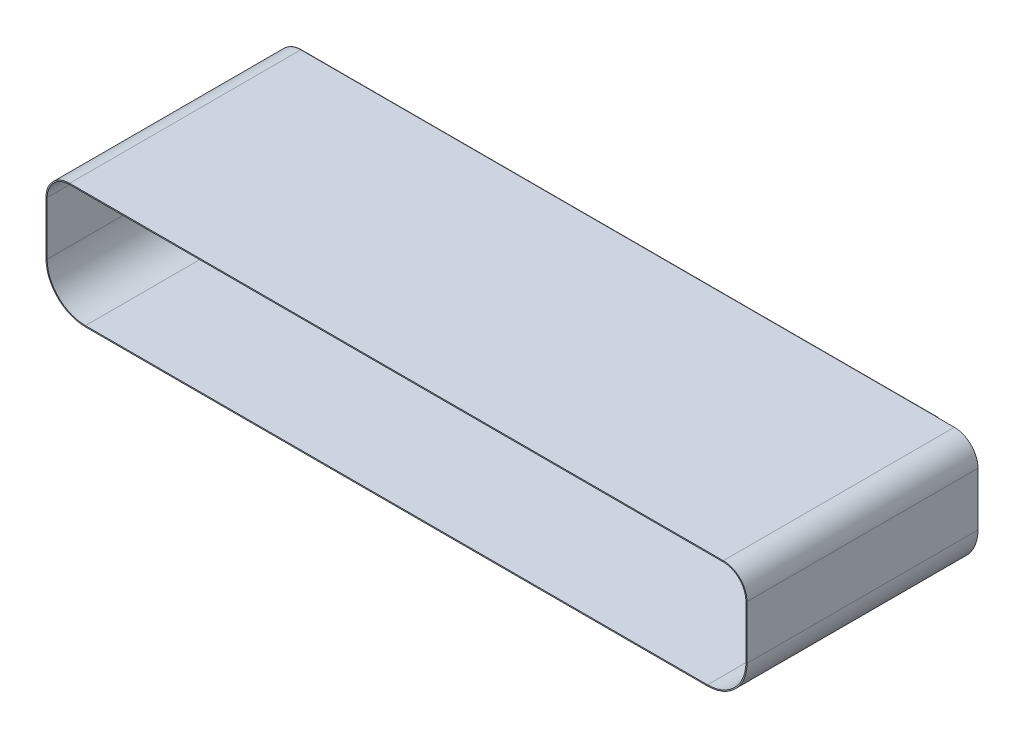
ISO-10303-21;
HEADER;
FILE_DESCRIPTION(('STEP AP214'),'2;1');
FILE_NAME('part.step','',(''),(''),'','','');
FILE_SCHEMA(('AUTOMOTIVE_DESIGN { 1 0 10303 214 1 1 1 1 }'));
ENDSEC;
DATA;
#1=APPLICATION_CONTEXT('core data for automotive mechanical design processes');
#2=APPLICATION_PROTOCOL_DEFINITION('international standard','automotive_design',2000,#1);
#3=PRODUCT_CONTEXT('',#1,'mechanical');
#4=PRODUCT('Part','Part','',(#3));
#5=PRODUCT_RELATED_PRODUCT_CATEGORY('part','',(#4));
#6=PRODUCT_DEFINITION_FORMATION('','',#4);
#7=PRODUCT_DEFINITION_CONTEXT('part definition',#1,'design');
#8=PRODUCT_DEFINITION('design','',#6,#7);
#9=PRODUCT_DEFINITION_SHAPE('','',#8);
#10=(LENGTH_UNIT() NAMED_UNIT(*) SI_UNIT(.MILLI.,.METRE.));
#11=(NAMED_UNIT(*) PLANE_ANGLE_UNIT() SI_UNIT($,.RADIAN.));
#12=(NAMED_UNIT(*) SI_UNIT($,.STERADIAN.) SOLID_ANGLE_UNIT());
#13=UNCERTAINTY_MEASURE_WITH_UNIT(LENGTH_MEASURE(1.E-05),#10,'distance_accuracy_value','');
#14=(GEOMETRIC_REPRESENTATION_CONTEXT(3) GLOBAL_UNCERTAINTY_ASSIGNED_CONTEXT((#13)) GLOBAL_UNIT_ASSIGNED_CONTEXT((#10,
#11,#12)) REPRESENTATION_CONTEXT('',''));
#15=CARTESIAN_POINT('',(0.,0.,0.));
#16=DIRECTION('',(0.,0.,1.));
#17=DIRECTION('',(1.,0.,0.));
#18=AXIS2_PLACEMENT_3D('',#15,#16,#17);
#19=CARTESIAN_POINT('',(14.25,-0.85496168638618,0.));
#20=DIRECTION('',(0.,0.,1.));
#21=DIRECTION('',(1.,0.,0.));
#22=AXIS2_PLACEMENT_3D('',#19,#20,#21);
#23=CYLINDRICAL_SURFACE('',#22,1.25);
#24=CARTESIAN_POINT('',(14.25,-0.85496168638618,10.));
#25=DIRECTION('',(0.,0.,1.));
#26=DIRECTION('',(1.,0.,0.));
#27=AXIS2_PLACEMENT_3D('',#24,#25,#26);
#28=CIRCLE('',#27,1.25);
#29=CARTESIAN_POINT('',(15.5,-0.85496168638618,10.));
#30=VERTEX_POINT('',#29);
#31=CARTESIAN_POINT('',(15.4942405118485,-0.97481805323832,10.));
#32=VERTEX_POINT('',#31);
#33=EDGE_CURVE('E19',#30,#32,#28,.F.);
#34=ORIENTED_EDGE('',*,*,#33,.F.);
#35=DIRECTION('',(0.,0.,1.));
#36=VECTOR('',#35,1.);
#37=CARTESIAN_POINT('',(15.5,-0.854961686386179,0.));
#38=LINE('',#37,#36);
#39=CARTESIAN_POINT('',(15.5,-0.85496168638618,-0.25));
#40=VERTEX_POINT('',#39);
#41=EDGE_CURVE('E191',#40,#30,#38,.T.);
#42=ORIENTED_EDGE('',*,*,#41,.F.);
#43=CARTESIAN_POINT('',(14.25,-0.85496168638618,-0.25));
#44=DIRECTION('',(0.,0.,1.));
#45=DIRECTION('',(1.,0.,0.));
#46=AXIS2_PLACEMENT_3D('',#43,#44,#45);
#47=CIRCLE('',#46,1.25);
#48=CARTESIAN_POINT('',(15.4942405118485,-0.97481805323832,-0.25));
#49=VERTEX_POINT('',#48);
#50=EDGE_CURVE('E187',#49,#40,#47,.T.);
#51=ORIENTED_EDGE('',*,*,#50,.F.);
#52=DIRECTION('',(0.,0.,1.));
#53=VECTOR('',#52,1.);
#54=CARTESIAN_POINT('',(15.4942405118485,-0.974818053238268,0.));
#55=LINE('',#54,#53);
#56=EDGE_CURVE('E185',#49,#32,#55,.T.);
#57=ORIENTED_EDGE('',*,*,#56,.T.);
#58=EDGE_LOOP('',(#34,#42,#51,#57));
#59=FACE_BOUND('',#58,.T.);
#60=ADVANCED_FACE('F16',(#59),#23,.F.);
#61=CARTESIAN_POINT('',(0.,0.,-0.25));
#62=DIRECTION('',(0.,0.,-1.));
#63=DIRECTION('',(-1.,0.,0.));
#64=AXIS2_PLACEMENT_3D('',#61,#62,#63);
#65=PLANE('',#64);
#66=CARTESIAN_POINT('',(13.8,-0.834999999999997,-0.25));
#67=DIRECTION('',(0.,0.,1.));
#68=DIRECTION('',(1.,0.,0.));
#69=AXIS2_PLACEMENT_3D('',#66,#67,#68);
#70=CIRCLE('',#69,1.75);
#71=CARTESIAN_POINT('',(13.8,-2.585,-0.25));
#72=VERTEX_POINT('',#71);
#73=CARTESIAN_POINT('',(15.55,-0.834999999999998,-0.25));
#74=VERTEX_POINT('',#73);
#75=EDGE_CURVE('E235',#72,#74,#70,.T.);
#76=ORIENTED_EDGE('',*,*,#75,.F.);
#77=DIRECTION('',(1.,0.,0.));
#78=VECTOR('',#77,1.);
#79=CARTESIAN_POINT('',(-13.8,-2.585,-0.25));
#80=LINE('',#79,#78);
#81=CARTESIAN_POINT('',(13.7274207377226,-2.585,-0.25));
#82=VERTEX_POINT('',#81);
#83=EDGE_CURVE('E275',#82,#72,#80,.T.);
#84=ORIENTED_EDGE('',*,*,#83,.F.);
#85=DIRECTION('',(0.,1.,0.));
#86=VECTOR('',#85,1.);
#87=CARTESIAN_POINT('',(13.7274207377226,0.,-0.25));
#88=LINE('',#87,#86);
#89=CARTESIAN_POINT('',(13.7274207377226,-2.535,-0.25));
#90=VERTEX_POINT('',#89);
#91=EDGE_CURVE('E183',#82,#90,#88,.T.);
#92=ORIENTED_EDGE('',*,*,#91,.T.);
#93=DIRECTION('',(-1.,0.,0.));
#94=VECTOR('',#93,1.);
#95=CARTESIAN_POINT('',(0.,-2.535,-0.25));
#96=LINE('',#95,#94);
#97=CARTESIAN_POINT('',(13.8,-2.535,-0.25));
#98=VERTEX_POINT('',#97);
#99=EDGE_CURVE('E243',#90,#98,#96,.F.);
#100=ORIENTED_EDGE('',*,*,#99,.T.);
#101=CARTESIAN_POINT('',(13.8,-0.834999999999997,-0.25));
#102=DIRECTION('',(0.,0.,1.));
#103=DIRECTION('',(1.,0.,0.));
#104=AXIS2_PLACEMENT_3D('',#101,#102,#103);
#105=CIRCLE('',#104,1.7);
#106=EDGE_CURVE('E192',#98,#49,#105,.T.);
#107=ORIENTED_EDGE('',*,*,#106,.T.);
#108=ORIENTED_EDGE('',*,*,#50,.T.);
#109=DIRECTION('',(0.,1.,0.));
#110=VECTOR('',#109,1.);
#111=CARTESIAN_POINT('',(15.5,1.535,-0.25));
#112=LINE('',#111,#110);
#113=CARTESIAN_POINT('',(15.5,1.535,-0.25));
#114=VERTEX_POINT('',#113);
#115=EDGE_CURVE('E229',#114,#40,#112,.F.);
#116=ORIENTED_EDGE('',*,*,#115,.F.);
#117=CARTESIAN_POINT('',(14.5,1.535,-0.25));
#118=DIRECTION('',(0.,0.,1.));
#119=DIRECTION('',(1.,0.,0.));
#120=AXIS2_PLACEMENT_3D('',#117,#118,#119);
#121=CIRCLE('',#120,1.);
#122=CARTESIAN_POINT('',(14.5,2.535,-0.25));
#123=VERTEX_POINT('',#122);
#124=EDGE_CURVE('E240',#114,#123,#121,.T.);
#125=ORIENTED_EDGE('',*,*,#124,.T.);
#126=DIRECTION('',(-1.,0.,0.));
#127=VECTOR('',#126,1.);
#128=CARTESIAN_POINT('',(0.,2.535,-0.25));
#129=LINE('',#128,#127);
#130=CARTESIAN_POINT('',(13.7274207377226,2.535,-0.25));
#131=VERTEX_POINT('',#130);
#132=EDGE_CURVE('E242',#123,#131,#129,.T.);
#133=ORIENTED_EDGE('',*,*,#132,.T.);
#134=DIRECTION('',(0.,1.,0.));
#135=VECTOR('',#134,1.);
#136=CARTESIAN_POINT('',(13.7274207377226,0.,-0.25));
#137=LINE('',#136,#135);
#138=CARTESIAN_POINT('',(13.7274207377226,2.585,-0.25));
#139=VERTEX_POINT('',#138);
#140=EDGE_CURVE('E282',#131,#139,#137,.T.);
#141=ORIENTED_EDGE('',*,*,#140,.T.);
#142=DIRECTION('',(-1.,0.,0.));
#143=VECTOR('',#142,1.);
#144=CARTESIAN_POINT('',(0.,2.585,-0.25));
#145=LINE('',#144,#143);
#146=CARTESIAN_POINT('',(14.5,2.585,-0.25));
#147=VERTEX_POINT('',#146);
#148=EDGE_CURVE('E285',#139,#147,#145,.F.);
#149=ORIENTED_EDGE('',*,*,#148,.T.);
#150=CARTESIAN_POINT('',(14.5,1.535,-0.25));
#151=DIRECTION('',(0.,0.,1.));
#152=DIRECTION('',(1.,0.,0.));
#153=AXIS2_PLACEMENT_3D('',#150,#151,#152);
#154=CIRCLE('',#153,1.05);
#155=CARTESIAN_POINT('',(15.55,1.535,-0.25));
#156=VERTEX_POINT('',#155);
#157=EDGE_CURVE('E231',#156,#147,#154,.T.);
#158=ORIENTED_EDGE('',*,*,#157,.F.);
#159=DIRECTION('',(0.,1.,0.));
#160=VECTOR('',#159,1.);
#161=CARTESIAN_POINT('',(15.55,-0.834999999999997,-0.25));
#162=LINE('',#161,#160);
#163=EDGE_CURVE('E257',#74,#156,#162,.T.);
#164=ORIENTED_EDGE('',*,*,#163,.F.);
#165=EDGE_LOOP('',(#76,#84,#92,#100,#107,#108,#116,#125,#133,#141,#149,#158,#164));
#166=FACE_BOUND('',#165,.T.);
#167=ADVANCED_FACE('F493',(#166),#65,.T.);
#168=CARTESIAN_POINT('',(-7.78064481556935,-2.535,-0.25));
#169=DIRECTION('',(-1.,0.,0.));
#170=DIRECTION('',(0.,-1.,0.));
#171=AXIS2_PLACEMENT_3D('',#168,#169,#170);
#172=CYLINDRICAL_SURFACE('',#171,0.05);
#173=CARTESIAN_POINT('',(-13.8,-2.535,-0.25));
#174=DIRECTION('',(-1.,0.,0.));
#175=DIRECTION('',(0.,-1.,0.));
#176=AXIS2_PLACEMENT_3D('',#173,#174,#175);
#177=CIRCLE('',#176,0.05);
#178=CARTESIAN_POINT('',(-13.8,-2.535,-0.3));
#179=VERTEX_POINT('',#178);
#180=CARTESIAN_POINT('',(-13.8,-2.585,-0.25));
#181=VERTEX_POINT('',#180);
#182=EDGE_CURVE('E468',#179,#181,#177,.T.);
#183=ORIENTED_EDGE('',*,*,#182,.F.);
#184=DIRECTION('',(-1.,0.,0.));
#185=VECTOR('',#184,1.);
#186=CARTESIAN_POINT('',(-1.76128963113871,-2.535,-0.3));
#187=LINE('',#186,#185);
#188=CARTESIAN_POINT('',(13.7274207377226,-2.535,-0.3));
#189=VERTEX_POINT('',#188);
#190=EDGE_CURVE('E383',#189,#179,#187,.T.);
#191=ORIENTED_EDGE('',*,*,#190,.F.);
#192=CARTESIAN_POINT('',(13.7274207377226,-2.535,-0.25));
#193=DIRECTION('',(-1.,0.,0.));
#194=DIRECTION('',(0.,-1.,0.));
#195=AXIS2_PLACEMENT_3D('',#192,#193,#194);
#196=CIRCLE('',#195,0.05);
#197=EDGE_CURVE('E227',#82,#189,#196,.F.);
#198=ORIENTED_EDGE('',*,*,#197,.F.);
#199=DIRECTION('',(1.,0.,0.));
#200=VECTOR('',#199,1.);
#201=CARTESIAN_POINT('',(-13.8,-2.585,-0.25));
#202=LINE('',#201,#200);
#203=EDGE_CURVE('E238',#181,#82,#202,.T.);
#204=ORIENTED_EDGE('',*,*,#203,.F.);
#205=EDGE_LOOP('',(#183,#191,#198,#204));
#206=FACE_BOUND('',#205,.T.);
#207=ADVANCED_FACE('F478',(#206),#172,.T.);
#208=CARTESIAN_POINT('',(-13.8,-0.834999999999998,-0.25));
#209=DIRECTION('',(0.,0.,-1.));
#210=DIRECTION('',(-1.,0.,0.));
#211=AXIS2_PLACEMENT_3D('',#208,#209,#210);
#212=TOROIDAL_SURFACE('',#211,1.7,0.05);
#213=ORIENTED_EDGE('',*,*,#182,.T.);
#214=CARTESIAN_POINT('',(-13.8,-0.834999999999998,-0.25));
#215=DIRECTION('',(0.,0.,1.));
#216=DIRECTION('',(1.,0.,0.));
#217=AXIS2_PLACEMENT_3D('',#214,#215,#216);
#218=CIRCLE('',#217,1.75);
#219=CARTESIAN_POINT('',(-15.55,-0.834999999999999,-0.25));
#220=VERTEX_POINT('',#219);
#221=EDGE_CURVE('E267',#220,#181,#218,.T.);
#222=ORIENTED_EDGE('',*,*,#221,.F.);
#223=CARTESIAN_POINT('',(-15.5,-0.834999999999999,-0.25));
#224=DIRECTION('',(0.,1.,0.));
#225=DIRECTION('',(-1.,0.,0.));
#226=AXIS2_PLACEMENT_3D('',#223,#224,#225);
#227=CIRCLE('',#226,0.05);
#228=CARTESIAN_POINT('',(-15.5,-0.834999999999999,-0.3));
#229=VERTEX_POINT('',#228);
#230=EDGE_CURVE('E459',#229,#220,#227,.T.);
#231=ORIENTED_EDGE('',*,*,#230,.F.);
#232=CARTESIAN_POINT('',(-13.8,-0.834999999999998,-0.3));
#233=DIRECTION('',(0.,0.,1.));
#234=DIRECTION('',(-1.,0.,0.));
#235=AXIS2_PLACEMENT_3D('',#232,#233,#234);
#236=CIRCLE('',#235,1.7);
#237=EDGE_CURVE('E347',#179,#229,#236,.F.);
#238=ORIENTED_EDGE('',*,*,#237,.F.);
#239=EDGE_LOOP('',(#213,#222,#231,#238));
#240=FACE_BOUND('',#239,.T.);
#241=ADVANCED_FACE('F474',(#240),#212,.T.);
#242=CARTESIAN_POINT('',(-15.5,0.767500000000008,-0.25));
#243=DIRECTION('',(0.,1.,0.));
#244=DIRECTION('',(-1.,0.,0.));
#245=AXIS2_PLACEMENT_3D('',#242,#243,#244);
#246=CYLINDRICAL_SURFACE('',#245,0.05);
#247=ORIENTED_EDGE('',*,*,#230,.T.);
#248=DIRECTION('',(0.,-1.,0.));
#249=VECTOR('',#248,1.);
#250=CARTESIAN_POINT('',(-15.55,1.535,-0.25));
#251=LINE('',#250,#249);
#252=CARTESIAN_POINT('',(-15.55,1.535,-0.25));
#253=VERTEX_POINT('',#252);
#254=EDGE_CURVE('E260',#253,#220,#251,.T.);
#255=ORIENTED_EDGE('',*,*,#254,.F.);
#256=CARTESIAN_POINT('',(-15.5,1.535,-0.25));
#257=DIRECTION('',(0.,1.,0.));
#258=DIRECTION('',(-1.,0.,0.));
#259=AXIS2_PLACEMENT_3D('',#256,#257,#258);
#260=CIRCLE('',#259,0.05);
#261=CARTESIAN_POINT('',(-15.5,1.535,-0.3));
#262=VERTEX_POINT('',#261);
#263=EDGE_CURVE('E259',#262,#253,#260,.T.);
#264=ORIENTED_EDGE('',*,*,#263,.F.);
#265=DIRECTION('',(0.,1.,0.));
#266=VECTOR('',#265,1.);
#267=CARTESIAN_POINT('',(-15.5,0.,-0.3));
#268=LINE('',#267,#266);
#269=EDGE_CURVE('E379',#229,#262,#268,.T.);
#270=ORIENTED_EDGE('',*,*,#269,.F.);
#271=EDGE_LOOP('',(#247,#255,#264,#270));
#272=FACE_BOUND('',#271,.T.);
#273=ADVANCED_FACE('F444',(#272),#246,.T.);
#274=CARTESIAN_POINT('',(-14.5,1.535,-0.25));
#275=DIRECTION('',(0.,0.,-1.));
#276=DIRECTION('',(-1.,0.,0.));
#277=AXIS2_PLACEMENT_3D('',#274,#275,#276);
#278=TOROIDAL_SURFACE('',#277,0.999999999999997,0.05);
#279=ORIENTED_EDGE('',*,*,#263,.T.);
#280=CARTESIAN_POINT('',(-14.5,1.535,-0.25));
#281=DIRECTION('',(0.,0.,1.));
#282=DIRECTION('',(1.,0.,0.));
#283=AXIS2_PLACEMENT_3D('',#280,#281,#282);
#284=CIRCLE('',#283,1.05);
#285=CARTESIAN_POINT('',(-14.5,2.585,-0.25));
#286=VERTEX_POINT('',#285);
#287=EDGE_CURVE('E413',#286,#253,#284,.T.);
#288=ORIENTED_EDGE('',*,*,#287,.F.);
#289=CARTESIAN_POINT('',(-14.5,2.535,-0.25));
#290=DIRECTION('',(1.,0.,0.));
#291=DIRECTION('',(0.,1.,0.));
#292=AXIS2_PLACEMENT_3D('',#289,#290,#291);
#293=CIRCLE('',#292,0.05);
#294=CARTESIAN_POINT('',(-14.5,2.535,-0.3));
#295=VERTEX_POINT('',#294);
#296=EDGE_CURVE('E451',#286,#295,#293,.F.);
#297=ORIENTED_EDGE('',*,*,#296,.T.);
#298=CARTESIAN_POINT('',(-14.5,1.535,-0.3));
#299=DIRECTION('',(0.,0.,1.));
#300=DIRECTION('',(0.,1.,0.));
#301=AXIS2_PLACEMENT_3D('',#298,#299,#300);
#302=CIRCLE('',#301,0.999999999999999);
#303=EDGE_CURVE('E221',#262,#295,#302,.F.);
#304=ORIENTED_EDGE('',*,*,#303,.F.);
#305=EDGE_LOOP('',(#279,#288,#297,#304));
#306=FACE_BOUND('',#305,.T.);
#307=ADVANCED_FACE('F438',(#306),#278,.T.);
#308=CARTESIAN_POINT('',(15.55,-0.834999999999997,0.));
#309=DIRECTION('',(1.,0.,0.));
#310=DIRECTION('',(0.,1.,0.));
#311=AXIS2_PLACEMENT_3D('',#308,#309,#310);
#312=PLANE('',#311);
#313=DIRECTION('',(0.,0.,1.));
#314=VECTOR('',#313,1.);
#315=CARTESIAN_POINT('',(15.55,-0.834999999999997,0.));
#316=LINE('',#315,#314);
#317=CARTESIAN_POINT('',(15.55,-0.834999999999997,10.));
#318=VERTEX_POINT('',#317);
#319=EDGE_CURVE('E239',#74,#318,#316,.T.);
#320=ORIENTED_EDGE('',*,*,#319,.F.);
#321=ORIENTED_EDGE('',*,*,#163,.T.);
#322=DIRECTION('',(0.,0.,1.));
#323=VECTOR('',#322,1.);
#324=CARTESIAN_POINT('',(15.55,1.535,0.));
#325=LINE('',#324,#323);
#326=CARTESIAN_POINT('',(15.55,1.535,10.));
#327=VERTEX_POINT('',#326);
#328=EDGE_CURVE('E234',#327,#156,#325,.F.);
#329=ORIENTED_EDGE('',*,*,#328,.F.);
#330=DIRECTION('',(0.,1.,0.));
#331=VECTOR('',#330,1.);
#332=CARTESIAN_POINT('',(15.55,0.,10.));
#333=LINE('',#332,#331);
#334=EDGE_CURVE('E216',#327,#318,#333,.F.);
#335=ORIENTED_EDGE('',*,*,#334,.T.);
#336=EDGE_LOOP('',(#320,#321,#329,#335));
#337=FACE_BOUND('',#336,.T.);
#338=ADVANCED_FACE('F443',(#337),#312,.T.);
#339=CARTESIAN_POINT('',(13.8,-0.834999999999997,0.));
#340=DIRECTION('',(0.,0.,1.));
#341=DIRECTION('',(1.,0.,0.));
#342=AXIS2_PLACEMENT_3D('',#339,#340,#341);
#343=CYLINDRICAL_SURFACE('',#342,1.75);
#344=DIRECTION('',(0.,0.,1.));
#345=VECTOR('',#344,1.);
#346=CARTESIAN_POINT('',(13.8,-2.585,0.));
#347=LINE('',#346,#345);
#348=CARTESIAN_POINT('',(13.8,-2.585,10.));
#349=VERTEX_POINT('',#348);
#350=EDGE_CURVE('E270',#72,#349,#347,.T.);
#351=ORIENTED_EDGE('',*,*,#350,.F.);
#352=ORIENTED_EDGE('',*,*,#75,.T.);
#353=ORIENTED_EDGE('',*,*,#319,.T.);
#354=CARTESIAN_POINT('',(13.8,-0.834999999999997,10.));
#355=DIRECTION('',(0.,0.,1.));
#356=DIRECTION('',(1.,0.,0.));
#357=AXIS2_PLACEMENT_3D('',#354,#355,#356);
#358=CIRCLE('',#357,1.75);
#359=EDGE_CURVE('E214',#318,#349,#358,.F.);
#360=ORIENTED_EDGE('',*,*,#359,.T.);
#361=EDGE_LOOP('',(#351,#352,#353,#360));
#362=FACE_BOUND('',#361,.T.);
#363=ADVANCED_FACE('F734',(#362),#343,.T.);
#364=CARTESIAN_POINT('',(-13.8,-2.585,0.));
#365=DIRECTION('',(0.,-1.,0.));
#366=DIRECTION('',(1.,0.,0.));
#367=AXIS2_PLACEMENT_3D('',#364,#365,#366);
#368=PLANE('',#367);
#369=DIRECTION('',(-1.,0.,0.));
#370=VECTOR('',#369,1.);
#371=CARTESIAN_POINT('',(0.,-2.585,10.));
#372=LINE('',#371,#370);
#373=CARTESIAN_POINT('',(-13.8,-2.585,10.));
#374=VERTEX_POINT('',#373);
#375=EDGE_CURVE('E213',#349,#374,#372,.T.);
#376=ORIENTED_EDGE('',*,*,#375,.T.);
#377=DIRECTION('',(0.,0.,1.));
#378=VECTOR('',#377,1.);
#379=CARTESIAN_POINT('',(-13.8,-2.585,0.));
#380=LINE('',#379,#378);
#381=EDGE_CURVE('E264',#181,#374,#380,.T.);
#382=ORIENTED_EDGE('',*,*,#381,.F.);
#383=ORIENTED_EDGE('',*,*,#203,.T.);
#384=ORIENTED_EDGE('',*,*,#83,.T.);
#385=ORIENTED_EDGE('',*,*,#350,.T.);
#386=EDGE_LOOP('',(#376,#382,#383,#384,#385));
#387=FACE_BOUND('',#386,.T.);
#388=ADVANCED_FACE('F726',(#387),#368,.T.);
#389=CARTESIAN_POINT('',(-13.8,-0.834999999999998,0.));
#390=DIRECTION('',(0.,0.,1.));
#391=DIRECTION('',(1.,0.,0.));
#392=AXIS2_PLACEMENT_3D('',#389,#390,#391);
#393=CYLINDRICAL_SURFACE('',#392,1.75);
#394=CARTESIAN_POINT('',(-13.8,-0.834999999999998,10.));
#395=DIRECTION('',(0.,0.,1.));
#396=DIRECTION('',(1.,0.,0.));
#397=AXIS2_PLACEMENT_3D('',#394,#395,#396);
#398=CIRCLE('',#397,1.75);
#399=CARTESIAN_POINT('',(-15.55,-0.834999999999999,10.));
#400=VERTEX_POINT('',#399);
#401=EDGE_CURVE('E211',#374,#400,#398,.F.);
#402=ORIENTED_EDGE('',*,*,#401,.T.);
#403=DIRECTION('',(0.,0.,1.));
#404=VECTOR('',#403,1.);
#405=CARTESIAN_POINT('',(-15.55,-0.834999999999999,0.));
#406=LINE('',#405,#404);
#407=EDGE_CURVE('E263',#220,#400,#406,.T.);
#408=ORIENTED_EDGE('',*,*,#407,.F.);
#409=ORIENTED_EDGE('',*,*,#221,.T.);
#410=ORIENTED_EDGE('',*,*,#381,.T.);
#411=EDGE_LOOP('',(#402,#408,#409,#410));
#412=FACE_BOUND('',#411,.T.);
#413=ADVANCED_FACE('F719',(#412),#393,.T.);
#414=CARTESIAN_POINT('',(-15.55,1.535,0.));
#415=DIRECTION('',(-1.,0.,0.));
#416=DIRECTION('',(0.,-1.,0.));
#417=AXIS2_PLACEMENT_3D('',#414,#415,#416);
#418=PLANE('',#417);
#419=DIRECTION('',(0.,1.,0.));
#420=VECTOR('',#419,1.);
#421=CARTESIAN_POINT('',(-15.55,0.,10.));
#422=LINE('',#421,#420);
#423=CARTESIAN_POINT('',(-15.55,1.535,10.));
#424=VERTEX_POINT('',#423);
#425=EDGE_CURVE('E210',#400,#424,#422,.T.);
#426=ORIENTED_EDGE('',*,*,#425,.T.);
#427=DIRECTION('',(0.,0.,1.));
#428=VECTOR('',#427,1.);
#429=CARTESIAN_POINT('',(-15.55,1.535,0.));
#430=LINE('',#429,#428);
#431=EDGE_CURVE('E408',#253,#424,#430,.T.);
#432=ORIENTED_EDGE('',*,*,#431,.F.);
#433=ORIENTED_EDGE('',*,*,#254,.T.);
#434=ORIENTED_EDGE('',*,*,#407,.T.);
#435=EDGE_LOOP('',(#426,#432,#433,#434));
#436=FACE_BOUND('',#435,.T.);
#437=ADVANCED_FACE('F597',(#436),#418,.T.);
#438=CARTESIAN_POINT('',(-14.5,1.535,0.));
#439=DIRECTION('',(0.,0.,1.));
#440=DIRECTION('',(1.,0.,0.));
#441=AXIS2_PLACEMENT_3D('',#438,#439,#440);
#442=CYLINDRICAL_SURFACE('',#441,1.05);
#443=CARTESIAN_POINT('',(-14.5,1.535,10.));
#444=DIRECTION('',(0.,0.,1.));
#445=DIRECTION('',(1.,0.,0.));
#446=AXIS2_PLACEMENT_3D('',#443,#444,#445);
#447=CIRCLE('',#446,1.05);
#448=CARTESIAN_POINT('',(-14.5,2.585,10.));
#449=VERTEX_POINT('',#448);
#450=EDGE_CURVE('E208',#424,#449,#447,.F.);
#451=ORIENTED_EDGE('',*,*,#450,.T.);
#452=DIRECTION('',(0.,0.,1.));
#453=VECTOR('',#452,1.);
#454=CARTESIAN_POINT('',(-14.5,2.585,0.));
#455=LINE('',#454,#453);
#456=EDGE_CURVE('E334',#286,#449,#455,.T.);
#457=ORIENTED_EDGE('',*,*,#456,.F.);
#458=ORIENTED_EDGE('',*,*,#287,.T.);
#459=ORIENTED_EDGE('',*,*,#431,.T.);
#460=EDGE_LOOP('',(#451,#457,#458,#459));
#461=FACE_BOUND('',#460,.T.);
#462=ADVANCED_FACE('F601',(#461),#442,.T.);
#463=CARTESIAN_POINT('',(14.5,1.535,0.));
#464=DIRECTION('',(0.,0.,1.));
#465=DIRECTION('',(1.,0.,0.));
#466=AXIS2_PLACEMENT_3D('',#463,#464,#465);
#467=CYLINDRICAL_SURFACE('',#466,1.05);
#468=ORIENTED_EDGE('',*,*,#328,.T.);
#469=ORIENTED_EDGE('',*,*,#157,.T.);
#470=DIRECTION('',(0.,0.,1.));
#471=VECTOR('',#470,1.);
#472=CARTESIAN_POINT('',(14.5,2.585,0.));
#473=LINE('',#472,#471);
#474=CARTESIAN_POINT('',(14.5,2.585,10.));
#475=VERTEX_POINT('',#474);
#476=EDGE_CURVE('E337',#475,#147,#473,.F.);
#477=ORIENTED_EDGE('',*,*,#476,.F.);
#478=CARTESIAN_POINT('',(14.5,1.535,10.));
#479=DIRECTION('',(0.,0.,1.));
#480=DIRECTION('',(1.,0.,0.));
#481=AXIS2_PLACEMENT_3D('',#478,#479,#480);
#482=CIRCLE('',#481,1.05);
#483=EDGE_CURVE('E198',#475,#327,#482,.F.);
#484=ORIENTED_EDGE('',*,*,#483,.T.);
#485=EDGE_LOOP('',(#468,#469,#477,#484));
#486=FACE_BOUND('',#485,.T.);
#487=ADVANCED_FACE('F699',(#486),#467,.T.);
#488=CARTESIAN_POINT('',(13.8,-0.834999999999997,0.));
#489=DIRECTION('',(0.,0.,1.));
#490=DIRECTION('',(1.,0.,0.));
#491=AXIS2_PLACEMENT_3D('',#488,#489,#490);
#492=CYLINDRICAL_SURFACE('',#491,1.7);
#493=CARTESIAN_POINT('',(13.8,-0.834999999999997,10.));
#494=DIRECTION('',(0.,0.,1.));
#495=DIRECTION('',(1.,0.,0.));
#496=AXIS2_PLACEMENT_3D('',#493,#494,#495);
#497=CIRCLE('',#496,1.7);
#498=CARTESIAN_POINT('',(13.8,-2.535,10.));
#499=VERTEX_POINT('',#498);
#500=EDGE_CURVE('E180',#499,#32,#497,.T.);
#501=ORIENTED_EDGE('',*,*,#500,.T.);
#502=ORIENTED_EDGE('',*,*,#56,.F.);
#503=ORIENTED_EDGE('',*,*,#106,.F.);
#504=DIRECTION('',(0.,0.,1.));
#505=VECTOR('',#504,1.);
#506=CARTESIAN_POINT('',(13.8,-2.535,0.));
#507=LINE('',#506,#505);
#508=EDGE_CURVE('E196',#499,#98,#507,.F.);
#509=ORIENTED_EDGE('',*,*,#508,.F.);
#510=EDGE_LOOP('',(#501,#502,#503,#509));
#511=FACE_BOUND('',#510,.T.);
#512=ADVANCED_FACE('F194',(#511),#492,.F.);
#513=CARTESIAN_POINT('',(15.5,1.535,0.));
#514=DIRECTION('',(-1.,0.,0.));
#515=DIRECTION('',(0.,0.,1.));
#516=AXIS2_PLACEMENT_3D('',#513,#514,#515);
#517=PLANE('',#516);
#518=DIRECTION('',(0.,0.,1.));
#519=VECTOR('',#518,1.);
#520=CARTESIAN_POINT('',(15.5,1.535,0.));
#521=LINE('',#520,#519);
#522=CARTESIAN_POINT('',(15.5,1.535,10.));
#523=VERTEX_POINT('',#522);
#524=EDGE_CURVE('E326',#523,#114,#521,.F.);
#525=ORIENTED_EDGE('',*,*,#524,.T.);
#526=ORIENTED_EDGE('',*,*,#115,.T.);
#527=ORIENTED_EDGE('',*,*,#41,.T.);
#528=DIRECTION('',(0.,1.,0.));
#529=VECTOR('',#528,1.);
#530=CARTESIAN_POINT('',(15.5,0.,10.));
#531=LINE('',#530,#529);
#532=EDGE_CURVE('E182',#30,#523,#531,.T.);
#533=ORIENTED_EDGE('',*,*,#532,.T.);
#534=EDGE_LOOP('',(#525,#526,#527,#533));
#535=FACE_BOUND('',#534,.T.);
#536=ADVANCED_FACE('F685',(#535),#517,.T.);
#537=CARTESIAN_POINT('',(13.7274207377226,2.585,-0.25));
#538=DIRECTION('',(1.,0.,0.));
#539=DIRECTION('',(0.,1.,0.));
#540=AXIS2_PLACEMENT_3D('',#537,#538,#539);
#541=PLANE('',#540);
#542=ORIENTED_EDGE('',*,*,#197,.T.);
#543=DIRECTION('',(0.,1.,0.));
#544=VECTOR('',#543,1.);
#545=CARTESIAN_POINT('',(13.7274207377226,0.,-0.3));
#546=LINE('',#545,#544);
#547=CARTESIAN_POINT('',(13.7274207377226,-0.600000008940697,-0.3));
#548=VERTEX_POINT('',#547);
#549=EDGE_CURVE('E225',#548,#189,#546,.F.);
#550=ORIENTED_EDGE('',*,*,#549,.F.);
#551=DIRECTION('',(0.,0.,1.));
#552=VECTOR('',#551,1.);
#553=CARTESIAN_POINT('',(13.7274207377226,-0.600000008940697,-0.275));
#554=LINE('',#553,#552);
#555=CARTESIAN_POINT('',(13.7274207377226,-0.600000008940697,-0.25));
#556=VERTEX_POINT('',#555);
#557=EDGE_CURVE('E391',#556,#548,#554,.F.);
#558=ORIENTED_EDGE('',*,*,#557,.F.);
#559=DIRECTION('',(0.,1.,0.));
#560=VECTOR('',#559,1.);
#561=CARTESIAN_POINT('',(13.7274207377226,0.,-0.25));
#562=LINE('',#561,#560);
#563=EDGE_CURVE('E305',#556,#90,#562,.F.);
#564=ORIENTED_EDGE('',*,*,#563,.T.);
#565=ORIENTED_EDGE('',*,*,#91,.F.);
#566=EDGE_LOOP('',(#542,#550,#558,#564,#565));
#567=FACE_BOUND('',#566,.T.);
#568=ADVANCED_FACE('F570',(#567),#541,.T.);
#569=CARTESIAN_POINT('',(13.8,-2.535,0.));
#570=DIRECTION('',(0.,1.,0.));
#571=DIRECTION('',(0.,0.,1.));
#572=AXIS2_PLACEMENT_3D('',#569,#570,#571);
#573=PLANE('',#572);
#574=ORIENTED_EDGE('',*,*,#99,.F.);
#575=DIRECTION('',(-1.,0.,0.));
#576=VECTOR('',#575,1.);
#577=CARTESIAN_POINT('',(-1.76128963113871,-2.535,-0.25));
#578=LINE('',#577,#576);
#579=CARTESIAN_POINT('',(-13.8,-2.535,-0.25));
#580=VERTEX_POINT('',#579);
#581=EDGE_CURVE('E303',#90,#580,#578,.T.);
#582=ORIENTED_EDGE('',*,*,#581,.T.);
#583=DIRECTION('',(0.,0.,1.));
#584=VECTOR('',#583,1.);
#585=CARTESIAN_POINT('',(-13.8,-2.535,0.));
#586=LINE('',#585,#584);
#587=CARTESIAN_POINT('',(-13.8,-2.535,10.));
#588=VERTEX_POINT('',#587);
#589=EDGE_CURVE('E400',#580,#588,#586,.T.);
#590=ORIENTED_EDGE('',*,*,#589,.T.);
#591=DIRECTION('',(-1.,0.,0.));
#592=VECTOR('',#591,1.);
#593=CARTESIAN_POINT('',(0.,-2.535,10.));
#594=LINE('',#593,#592);
#595=EDGE_CURVE('E309',#588,#499,#594,.F.);
#596=ORIENTED_EDGE('',*,*,#595,.T.);
#597=ORIENTED_EDGE('',*,*,#508,.T.);
#598=EDGE_LOOP('',(#574,#582,#590,#596,#597));
#599=FACE_BOUND('',#598,.T.);
#600=ADVANCED_FACE('F671',(#599),#573,.T.);
#601=CARTESIAN_POINT('',(-13.8,-0.834999999999998,0.));
#602=DIRECTION('',(0.,0.,1.));
#603=DIRECTION('',(1.,0.,0.));
#604=AXIS2_PLACEMENT_3D('',#601,#602,#603);
#605=CYLINDRICAL_SURFACE('',#604,1.7);
#606=CARTESIAN_POINT('',(-13.8,-0.834999999999998,10.));
#607=DIRECTION('',(0.,0.,1.));
#608=DIRECTION('',(1.,0.,0.));
#609=AXIS2_PLACEMENT_3D('',#606,#607,#608);
#610=CIRCLE('',#609,1.7);
#611=CARTESIAN_POINT('',(-15.5,-0.834999999999999,10.));
#612=VERTEX_POINT('',#611);
#613=EDGE_CURVE('E307',#612,#588,#610,.T.);
#614=ORIENTED_EDGE('',*,*,#613,.T.);
#615=ORIENTED_EDGE('',*,*,#589,.F.);
#616=CARTESIAN_POINT('',(-13.8,-0.834999999999998,-0.25));
#617=DIRECTION('',(0.,0.,1.));
#618=DIRECTION('',(1.,0.,0.));
#619=AXIS2_PLACEMENT_3D('',#616,#617,#618);
#620=CIRCLE('',#619,1.7);
#621=CARTESIAN_POINT('',(-15.5,-0.834999999999999,-0.25));
#622=VERTEX_POINT('',#621);
#623=EDGE_CURVE('E301',#580,#622,#620,.F.);
#624=ORIENTED_EDGE('',*,*,#623,.T.);
#625=DIRECTION('',(0.,0.,-1.));
#626=VECTOR('',#625,1.);
#627=CARTESIAN_POINT('',(-15.5,-0.834999999999999,0.));
#628=LINE('',#627,#626);
#629=EDGE_CURVE('E397',#612,#622,#628,.T.);
#630=ORIENTED_EDGE('',*,*,#629,.F.);
#631=EDGE_LOOP('',(#614,#615,#624,#630));
#632=FACE_BOUND('',#631,.T.);
#633=ADVANCED_FACE('F664',(#632),#605,.F.);
#634=CARTESIAN_POINT('',(-15.5,-0.834999999999999,0.));
#635=DIRECTION('',(1.,0.,0.));
#636=DIRECTION('',(0.,0.,-1.));
#637=AXIS2_PLACEMENT_3D('',#634,#635,#636);
#638=PLANE('',#637);
#639=ORIENTED_EDGE('',*,*,#629,.T.);
#640=DIRECTION('',(0.,1.,0.));
#641=VECTOR('',#640,1.);
#642=CARTESIAN_POINT('',(-15.5,0.,-0.25));
#643=LINE('',#642,#641);
#644=CARTESIAN_POINT('',(-15.5,1.535,-0.25));
#645=VERTEX_POINT('',#644);
#646=EDGE_CURVE('E300',#622,#645,#643,.T.);
#647=ORIENTED_EDGE('',*,*,#646,.T.);
#648=DIRECTION('',(0.,0.,1.));
#649=VECTOR('',#648,1.);
#650=CARTESIAN_POINT('',(-15.5,1.535,0.));
#651=LINE('',#650,#649);
#652=CARTESIAN_POINT('',(-15.5,1.535,10.));
#653=VERTEX_POINT('',#652);
#654=EDGE_CURVE('E306',#645,#653,#651,.T.);
#655=ORIENTED_EDGE('',*,*,#654,.T.);
#656=DIRECTION('',(0.,1.,0.));
#657=VECTOR('',#656,1.);
#658=CARTESIAN_POINT('',(-15.5,0.,10.));
#659=LINE('',#658,#657);
#660=EDGE_CURVE('E310',#653,#612,#659,.F.);
#661=ORIENTED_EDGE('',*,*,#660,.T.);
#662=EDGE_LOOP('',(#639,#647,#655,#661));
#663=FACE_BOUND('',#662,.T.);
#664=ADVANCED_FACE('F657',(#663),#638,.T.);
#665=CARTESIAN_POINT('',(10.7999997809529,1.3999999910593,-0.3));
#666=DIRECTION('',(0.,0.,1.));
#667=DIRECTION('',(1.,0.,0.));
#668=AXIS2_PLACEMENT_3D('',#665,#666,#667);
#669=CYLINDRICAL_SURFACE('',#668,1.);
#670=DIRECTION('',(0.,0.,1.));
#671=VECTOR('',#670,1.);
#672=CARTESIAN_POINT('',(9.7999997809529,1.3999999910593,-0.3));
#673=LINE('',#672,#671);
#674=CARTESIAN_POINT('',(9.79999978095292,1.3999999910593,-0.25));
#675=VERTEX_POINT('',#674);
#676=CARTESIAN_POINT('',(9.79999978095292,1.3999999910593,-0.3));
#677=VERTEX_POINT('',#676);
#678=EDGE_CURVE('E395',#675,#677,#673,.F.);
#679=ORIENTED_EDGE('',*,*,#678,.F.);
#680=CARTESIAN_POINT('',(10.7999997809529,1.3999999910593,-0.25));
#681=DIRECTION('',(0.,0.,1.));
#682=DIRECTION('',(1.,0.,0.));
#683=AXIS2_PLACEMENT_3D('',#680,#681,#682);
#684=CIRCLE('',#683,1.);
#685=CARTESIAN_POINT('',(10.7999997809529,0.399999991059303,-0.25));
#686=VERTEX_POINT('',#685);
#687=EDGE_CURVE('E296',#675,#686,#684,.T.);
#688=ORIENTED_EDGE('',*,*,#687,.T.);
#689=DIRECTION('',(0.,0.,-1.));
#690=VECTOR('',#689,1.);
#691=CARTESIAN_POINT('',(10.7999997809529,0.399999991059303,-0.3));
#692=LINE('',#691,#690);
#693=CARTESIAN_POINT('',(10.7999997809529,0.399999991059303,-0.3));
#694=VERTEX_POINT('',#693);
#695=EDGE_CURVE('E393',#686,#694,#692,.T.);
#696=ORIENTED_EDGE('',*,*,#695,.T.);
#697=CARTESIAN_POINT('',(10.7999997809529,1.3999999910593,-0.3));
#698=DIRECTION('',(0.,0.,1.));
#699=DIRECTION('',(1.,0.,0.));
#700=AXIS2_PLACEMENT_3D('',#697,#698,#699);
#701=CIRCLE('',#700,1.);
#702=EDGE_CURVE('E217',#677,#694,#701,.T.);
#703=ORIENTED_EDGE('',*,*,#702,.F.);
#704=EDGE_LOOP('',(#679,#688,#696,#703));
#705=FACE_BOUND('',#704,.T.);
#706=ADVANCED_FACE('F558',(#705),#669,.F.);
#707=CARTESIAN_POINT('',(9.79999978095293,0.399999991059303,-0.3));
#708=DIRECTION('',(0.,-1.,0.));
#709=DIRECTION('',(0.,0.,-1.));
#710=AXIS2_PLACEMENT_3D('',#707,#708,#709);
#711=PLANE('',#710);
#712=DIRECTION('',(-1.,0.,0.));
#713=VECTOR('',#712,1.);
#714=CARTESIAN_POINT('',(-1.76128963113871,0.399999991059303,-0.25));
#715=LINE('',#714,#713);
#716=CARTESIAN_POINT('',(12.7274207377226,0.399999991059303,-0.25));
#717=VERTEX_POINT('',#716);
#718=EDGE_CURVE('E295',#686,#717,#715,.F.);
#719=ORIENTED_EDGE('',*,*,#718,.T.);
#720=DIRECTION('',(0.,0.,1.));
#721=VECTOR('',#720,1.);
#722=CARTESIAN_POINT('',(12.7274207377226,0.399999991059303,-0.275));
#723=LINE('',#722,#721);
#724=CARTESIAN_POINT('',(12.7274207377226,0.399999991059303,-0.3));
#725=VERTEX_POINT('',#724);
#726=EDGE_CURVE('E226',#725,#717,#723,.T.);
#727=ORIENTED_EDGE('',*,*,#726,.F.);
#728=DIRECTION('',(-1.,0.,0.));
#729=VECTOR('',#728,1.);
#730=CARTESIAN_POINT('',(-1.76128963113871,0.399999991059303,-0.3));
#731=LINE('',#730,#729);
#732=EDGE_CURVE('E220',#694,#725,#731,.F.);
#733=ORIENTED_EDGE('',*,*,#732,.F.);
#734=ORIENTED_EDGE('',*,*,#695,.F.);
#735=EDGE_LOOP('',(#719,#727,#733,#734));
#736=FACE_BOUND('',#735,.T.);
#737=ADVANCED_FACE('F563',(#736),#711,.F.);
#738=CARTESIAN_POINT('',(12.7274207377226,-0.600000008940697,-0.275));
#739=DIRECTION('',(0.,0.,1.));
#740=DIRECTION('',(1.,0.,0.));
#741=AXIS2_PLACEMENT_3D('',#738,#739,#740);
#742=CYLINDRICAL_SURFACE('',#741,1.);
#743=CARTESIAN_POINT('',(12.7274207377226,-0.600000008940697,-0.3));
#744=DIRECTION('',(0.,0.,1.));
#745=DIRECTION('',(1.,0.,0.));
#746=AXIS2_PLACEMENT_3D('',#743,#744,#745);
#747=CIRCLE('',#746,1.);
#748=EDGE_CURVE('E222',#725,#548,#747,.F.);
#749=ORIENTED_EDGE('',*,*,#748,.F.);
#750=ORIENTED_EDGE('',*,*,#726,.T.);
#751=CARTESIAN_POINT('',(12.7274207377226,-0.600000008940697,-0.25));
#752=DIRECTION('',(0.,0.,1.));
#753=DIRECTION('',(1.,0.,0.));
#754=AXIS2_PLACEMENT_3D('',#751,#752,#753);
#755=CIRCLE('',#754,1.);
#756=EDGE_CURVE('E291',#717,#556,#755,.F.);
#757=ORIENTED_EDGE('',*,*,#756,.T.);
#758=ORIENTED_EDGE('',*,*,#557,.T.);
#759=EDGE_LOOP('',(#749,#750,#757,#758));
#760=FACE_BOUND('',#759,.T.);
#761=ADVANCED_FACE('F365',(#760),#742,.T.);
#762=CARTESIAN_POINT('',(-1.76128963113871,0.,-0.3));
#763=DIRECTION('',(0.,0.,-1.));
#764=DIRECTION('',(-1.,0.,0.));
#765=AXIS2_PLACEMENT_3D('',#762,#763,#764);
#766=PLANE('',#765);
#767=ORIENTED_EDGE('',*,*,#702,.T.);
#768=ORIENTED_EDGE('',*,*,#732,.T.);
#769=ORIENTED_EDGE('',*,*,#748,.T.);
#770=ORIENTED_EDGE('',*,*,#549,.T.);
#771=ORIENTED_EDGE('',*,*,#190,.T.);
#772=ORIENTED_EDGE('',*,*,#237,.T.);
#773=ORIENTED_EDGE('',*,*,#269,.T.);
#774=ORIENTED_EDGE('',*,*,#303,.T.);
#775=DIRECTION('',(1.,0.,0.));
#776=VECTOR('',#775,1.);
#777=CARTESIAN_POINT('',(6.36935518443064,2.535,-0.3));
#778=LINE('',#777,#776);
#779=CARTESIAN_POINT('',(9.79999978095293,2.535,-0.3));
#780=VERTEX_POINT('',#779);
#781=EDGE_CURVE('E331',#780,#295,#778,.F.);
#782=ORIENTED_EDGE('',*,*,#781,.F.);
#783=DIRECTION('',(0.,-1.,0.));
#784=VECTOR('',#783,1.);
#785=CARTESIAN_POINT('',(9.79999978095293,2.535,-0.3));
#786=LINE('',#785,#784);
#787=EDGE_CURVE('E529',#780,#677,#786,.T.);
#788=ORIENTED_EDGE('',*,*,#787,.T.);
#789=EDGE_LOOP('',(#767,#768,#769,#770,#771,#772,#773,#774,#782,#788));
#790=FACE_BOUND('',#789,.T.);
#791=ADVANCED_FACE('F354',(#790),#766,.T.);
#792=CARTESIAN_POINT('',(14.5,2.585,0.));
#793=DIRECTION('',(0.,1.,0.));
#794=DIRECTION('',(-1.,0.,0.));
#795=AXIS2_PLACEMENT_3D('',#792,#793,#794);
#796=PLANE('',#795);
#797=ORIENTED_EDGE('',*,*,#476,.T.);
#798=ORIENTED_EDGE('',*,*,#148,.F.);
#799=DIRECTION('',(1.,0.,0.));
#800=VECTOR('',#799,1.);
#801=CARTESIAN_POINT('',(6.36935518443064,2.585,-0.25));
#802=LINE('',#801,#800);
#803=EDGE_CURVE('E290',#286,#139,#802,.T.);
#804=ORIENTED_EDGE('',*,*,#803,.F.);
#805=ORIENTED_EDGE('',*,*,#456,.T.);
#806=DIRECTION('',(-1.,0.,0.));
#807=VECTOR('',#806,1.);
#808=CARTESIAN_POINT('',(0.,2.585,10.));
#809=LINE('',#808,#807);
#810=EDGE_CURVE('E203',#449,#475,#809,.F.);
#811=ORIENTED_EDGE('',*,*,#810,.T.);
#812=EDGE_LOOP('',(#797,#798,#804,#805,#811));
#813=FACE_BOUND('',#812,.T.);
#814=ADVANCED_FACE('F364',(#813),#796,.T.);
#815=CARTESIAN_POINT('',(14.5,1.535,0.));
#816=DIRECTION('',(0.,0.,1.));
#817=DIRECTION('',(1.,0.,0.));
#818=AXIS2_PLACEMENT_3D('',#815,#816,#817);
#819=CYLINDRICAL_SURFACE('',#818,1.);
#820=CARTESIAN_POINT('',(14.5,1.535,10.));
#821=DIRECTION('',(0.,0.,1.));
#822=DIRECTION('',(1.,0.,0.));
#823=AXIS2_PLACEMENT_3D('',#820,#821,#822);
#824=CIRCLE('',#823,1.);
#825=CARTESIAN_POINT('',(14.5,2.535,10.));
#826=VERTEX_POINT('',#825);
#827=EDGE_CURVE('E200',#523,#826,#824,.T.);
#828=ORIENTED_EDGE('',*,*,#827,.T.);
#829=DIRECTION('',(0.,0.,-1.));
#830=VECTOR('',#829,1.);
#831=CARTESIAN_POINT('',(14.5,2.535,0.));
#832=LINE('',#831,#830);
#833=EDGE_CURVE('E289',#123,#826,#832,.F.);
#834=ORIENTED_EDGE('',*,*,#833,.F.);
#835=ORIENTED_EDGE('',*,*,#124,.F.);
#836=ORIENTED_EDGE('',*,*,#524,.F.);
#837=EDGE_LOOP('',(#828,#834,#835,#836));
#838=FACE_BOUND('',#837,.T.);
#839=ADVANCED_FACE('F501',(#838),#819,.F.);
#840=CARTESIAN_POINT('',(0.,0.,10.));
#841=DIRECTION('',(0.,0.,-1.));
#842=DIRECTION('',(-1.,0.,0.));
#843=AXIS2_PLACEMENT_3D('',#840,#841,#842);
#844=PLANE('',#843);
#845=ORIENTED_EDGE('',*,*,#613,.F.);
#846=ORIENTED_EDGE('',*,*,#660,.F.);
#847=CARTESIAN_POINT('',(-14.5,1.535,10.));
#848=DIRECTION('',(0.,0.,1.));
#849=DIRECTION('',(1.,0.,0.));
#850=AXIS2_PLACEMENT_3D('',#847,#848,#849);
#851=CIRCLE('',#850,0.999999999999999);
#852=CARTESIAN_POINT('',(-14.5,2.535,10.));
#853=VERTEX_POINT('',#852);
#854=EDGE_CURVE('E304',#653,#853,#851,.F.);
#855=ORIENTED_EDGE('',*,*,#854,.T.);
#856=DIRECTION('',(1.,0.,0.));
#857=VECTOR('',#856,1.);
#858=CARTESIAN_POINT('',(-14.5,2.535,10.));
#859=LINE('',#858,#857);
#860=EDGE_CURVE('E329',#826,#853,#859,.F.);
#861=ORIENTED_EDGE('',*,*,#860,.F.);
#862=ORIENTED_EDGE('',*,*,#827,.F.);
#863=ORIENTED_EDGE('',*,*,#532,.F.);
#864=ORIENTED_EDGE('',*,*,#33,.T.);
#865=ORIENTED_EDGE('',*,*,#500,.F.);
#866=ORIENTED_EDGE('',*,*,#595,.F.);
#867=EDGE_LOOP('',(#845,#846,#855,#861,#862,#863,#864,#865,#866));
#868=FACE_BOUND('',#867,.T.);
#869=ORIENTED_EDGE('',*,*,#810,.F.);
#870=ORIENTED_EDGE('',*,*,#450,.F.);
#871=ORIENTED_EDGE('',*,*,#425,.F.);
#872=ORIENTED_EDGE('',*,*,#401,.F.);
#873=ORIENTED_EDGE('',*,*,#375,.F.);
#874=ORIENTED_EDGE('',*,*,#359,.F.);
#875=ORIENTED_EDGE('',*,*,#334,.F.);
#876=ORIENTED_EDGE('',*,*,#483,.F.);
#877=EDGE_LOOP('',(#869,#870,#871,#872,#873,#874,#875,#876));
#878=FACE_BOUND('',#877,.T.);
#879=ADVANCED_FACE('F176',(#868,#878),#844,.F.);
#880=CARTESIAN_POINT('',(-14.5,1.535,0.));
#881=DIRECTION('',(0.,0.,1.));
#882=DIRECTION('',(1.,0.,0.));
#883=AXIS2_PLACEMENT_3D('',#880,#881,#882);
#884=CYLINDRICAL_SURFACE('',#883,0.999999999999999);
#885=ORIENTED_EDGE('',*,*,#854,.F.);
#886=ORIENTED_EDGE('',*,*,#654,.F.);
#887=CARTESIAN_POINT('',(-14.5,1.535,-0.25));
#888=DIRECTION('',(0.,0.,1.));
#889=DIRECTION('',(1.,0.,0.));
#890=AXIS2_PLACEMENT_3D('',#887,#888,#889);
#891=CIRCLE('',#890,0.999999999999999);
#892=CARTESIAN_POINT('',(-14.5,2.535,-0.25));
#893=VERTEX_POINT('',#892);
#894=EDGE_CURVE('E298',#645,#893,#891,.F.);
#895=ORIENTED_EDGE('',*,*,#894,.T.);
#896=DIRECTION('',(0.,0.,-1.));
#897=VECTOR('',#896,1.);
#898=CARTESIAN_POINT('',(-14.5,2.535,0.));
#899=LINE('',#898,#897);
#900=EDGE_CURVE('E507',#853,#893,#899,.T.);
#901=ORIENTED_EDGE('',*,*,#900,.F.);
#902=EDGE_LOOP('',(#885,#886,#895,#901));
#903=FACE_BOUND('',#902,.T.);
#904=ADVANCED_FACE('F623',(#903),#884,.F.);
#905=CARTESIAN_POINT('',(-1.76128963113871,0.,-0.25));
#906=DIRECTION('',(0.,0.,-1.));
#907=DIRECTION('',(-1.,0.,0.));
#908=AXIS2_PLACEMENT_3D('',#905,#906,#907);
#909=PLANE('',#908);
#910=ORIENTED_EDGE('',*,*,#718,.F.);
#911=ORIENTED_EDGE('',*,*,#687,.F.);
#912=DIRECTION('',(0.,-1.,0.));
#913=VECTOR('',#912,1.);
#914=CARTESIAN_POINT('',(9.79999978095293,2.535,-0.25));
#915=LINE('',#914,#913);
#916=CARTESIAN_POINT('',(9.79999978095293,2.535,-0.25));
#917=VERTEX_POINT('',#916);
#918=EDGE_CURVE('E294',#675,#917,#915,.F.);
#919=ORIENTED_EDGE('',*,*,#918,.T.);
#920=DIRECTION('',(1.,0.,0.));
#921=VECTOR('',#920,1.);
#922=CARTESIAN_POINT('',(-14.5,2.535,-0.25));
#923=LINE('',#922,#921);
#924=EDGE_CURVE('E508',#893,#917,#923,.T.);
#925=ORIENTED_EDGE('',*,*,#924,.F.);
#926=ORIENTED_EDGE('',*,*,#894,.F.);
#927=ORIENTED_EDGE('',*,*,#646,.F.);
#928=ORIENTED_EDGE('',*,*,#623,.F.);
#929=ORIENTED_EDGE('',*,*,#581,.F.);
#930=ORIENTED_EDGE('',*,*,#563,.F.);
#931=ORIENTED_EDGE('',*,*,#756,.F.);
#932=EDGE_LOOP('',(#910,#911,#919,#925,#926,#927,#928,#929,#930,#931));
#933=FACE_BOUND('',#932,.T.);
#934=ADVANCED_FACE('F620',(#933),#909,.F.);
#935=CARTESIAN_POINT('',(9.79999978095293,2.535,-0.3));
#936=DIRECTION('',(-1.,0.,0.));
#937=DIRECTION('',(0.,-1.,0.));
#938=AXIS2_PLACEMENT_3D('',#935,#936,#937);
#939=PLANE('',#938);
#940=ORIENTED_EDGE('',*,*,#787,.F.);
#941=DIRECTION('',(0.,0.,-1.));
#942=VECTOR('',#941,1.);
#943=CARTESIAN_POINT('',(9.79999978095293,2.535,0.));
#944=LINE('',#943,#942);
#945=EDGE_CURVE('E524',#917,#780,#944,.T.);
#946=ORIENTED_EDGE('',*,*,#945,.F.);
#947=ORIENTED_EDGE('',*,*,#918,.F.);
#948=ORIENTED_EDGE('',*,*,#678,.T.);
#949=EDGE_LOOP('',(#940,#946,#947,#948));
#950=FACE_BOUND('',#949,.T.);
#951=ADVANCED_FACE('F553',(#950),#939,.F.);
#952=CARTESIAN_POINT('',(6.36935518443064,2.535,-0.25));
#953=DIRECTION('',(1.,0.,0.));
#954=DIRECTION('',(0.,1.,0.));
#955=AXIS2_PLACEMENT_3D('',#952,#953,#954);
#956=CYLINDRICAL_SURFACE('',#955,0.05);
#957=ORIENTED_EDGE('',*,*,#296,.F.);
#958=ORIENTED_EDGE('',*,*,#803,.T.);
#959=CARTESIAN_POINT('',(13.7274207377226,2.535,-0.25));
#960=DIRECTION('',(1.,0.,0.));
#961=DIRECTION('',(0.,1.,0.));
#962=AXIS2_PLACEMENT_3D('',#959,#960,#961);
#963=CIRCLE('',#962,0.05);
#964=CARTESIAN_POINT('',(13.7274207377226,2.535,-0.3));
#965=VERTEX_POINT('',#964);
#966=EDGE_CURVE('E34',#965,#139,#963,.T.);
#967=ORIENTED_EDGE('',*,*,#966,.F.);
#968=DIRECTION('',(1.,0.,0.));
#969=VECTOR('',#968,1.);
#970=CARTESIAN_POINT('',(-14.5,2.535,-0.3));
#971=LINE('',#970,#969);
#972=EDGE_CURVE('E25',#780,#965,#971,.T.);
#973=ORIENTED_EDGE('',*,*,#972,.F.);
#974=ORIENTED_EDGE('',*,*,#781,.T.);
#975=EDGE_LOOP('',(#957,#958,#967,#973,#974));
#976=FACE_BOUND('',#975,.T.);
#977=ADVANCED_FACE('F548',(#976),#956,.T.);
#978=CARTESIAN_POINT('',(13.7274207377226,2.585,-0.25));
#979=DIRECTION('',(1.,0.,0.));
#980=DIRECTION('',(0.,1.,0.));
#981=AXIS2_PLACEMENT_3D('',#978,#979,#980);
#982=PLANE('',#981);
#983=ORIENTED_EDGE('',*,*,#966,.T.);
#984=ORIENTED_EDGE('',*,*,#140,.F.);
#985=DIRECTION('',(0.,0.,-1.));
#986=VECTOR('',#985,1.);
#987=CARTESIAN_POINT('',(13.7274207377226,2.535,0.));
#988=LINE('',#987,#986);
#989=EDGE_CURVE('E11',#965,#131,#988,.F.);
#990=ORIENTED_EDGE('',*,*,#989,.F.);
#991=EDGE_LOOP('',(#983,#984,#990));
#992=FACE_BOUND('',#991,.T.);
#993=ADVANCED_FACE('F607',(#992),#982,.T.);
#994=CARTESIAN_POINT('',(-14.5,2.535,0.));
#995=DIRECTION('',(0.,-1.,0.));
#996=DIRECTION('',(0.,0.,-1.));
#997=AXIS2_PLACEMENT_3D('',#994,#995,#996);
#998=PLANE('',#997);
#999=ORIENTED_EDGE('',*,*,#989,.T.);
#1000=ORIENTED_EDGE('',*,*,#132,.F.);
#1001=ORIENTED_EDGE('',*,*,#833,.T.);
#1002=ORIENTED_EDGE('',*,*,#860,.T.);
#1003=ORIENTED_EDGE('',*,*,#900,.T.);
#1004=ORIENTED_EDGE('',*,*,#924,.T.);
#1005=ORIENTED_EDGE('',*,*,#945,.T.);
#1006=ORIENTED_EDGE('',*,*,#972,.T.);
#1007=EDGE_LOOP('',(#999,#1000,#1001,#1002,#1003,#1004,#1005,#1006));
#1008=FACE_BOUND('',#1007,.T.);
#1009=ADVANCED_FACE('F497',(#1008),#998,.T.);
#1010=CLOSED_SHELL('',(#60,#167,#207,#241,#273,#307,#338,#363,#388,#413,#437,#462,#487,#512,
#536,#568,#600,#633,#664,#706,#737,#761,#791,#814,#839,#879,#904,#934,#951,#977,#993,#1009));
#1011=MANIFOLD_SOLID_BREP('B1',#1010);
#1012=ADVANCED_BREP_SHAPE_REPRESENTATION('',(#18,#1011),#14);
#1013=SHAPE_DEFINITION_REPRESENTATION(#9,#1012);
ENDSEC;
END-ISO-10303-21;
